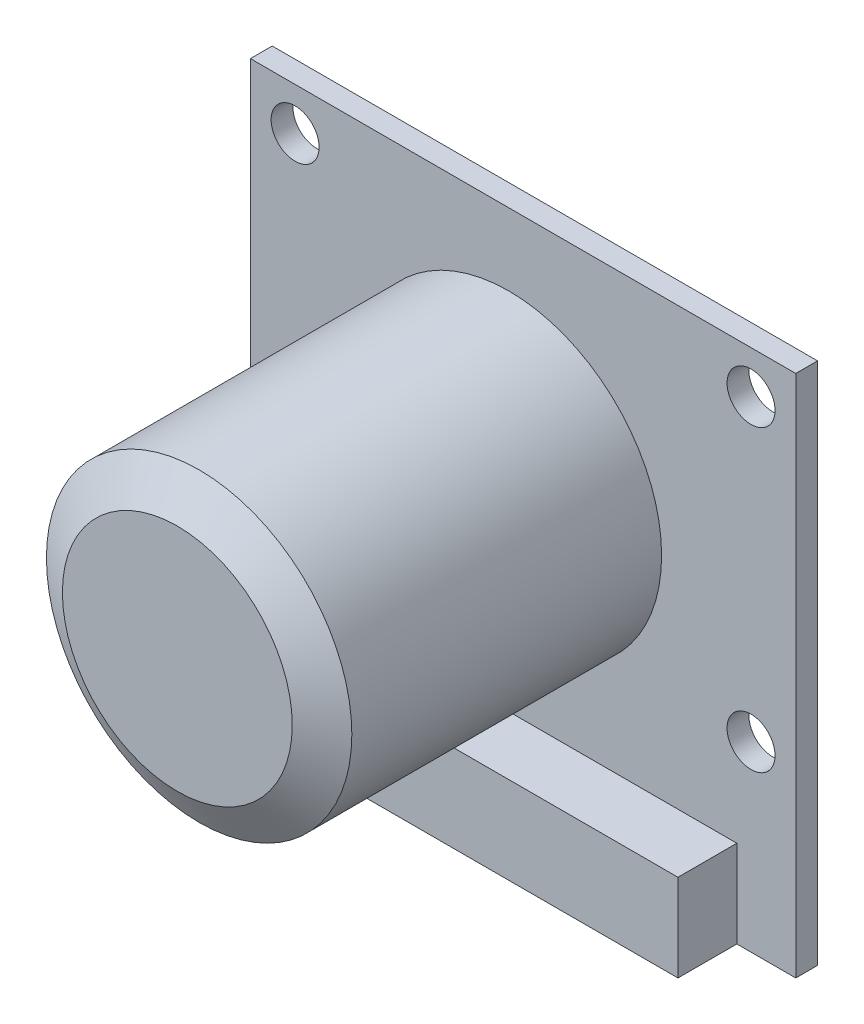
ISO-10303-21;
HEADER;
FILE_DESCRIPTION(('STEP AP214'),'2;1');
FILE_NAME('part.step','',(''),(''),'','','');
FILE_SCHEMA(('AUTOMOTIVE_DESIGN { 1 0 10303 214 1 1 1 1 }'));
ENDSEC;
DATA;
#1=APPLICATION_CONTEXT('core data for automotive mechanical design processes');
#2=APPLICATION_PROTOCOL_DEFINITION('international standard','automotive_design',2000,#1);
#3=PRODUCT_CONTEXT('',#1,'mechanical');
#4=PRODUCT('Part','Part','',(#3));
#5=PRODUCT_RELATED_PRODUCT_CATEGORY('part','',(#4));
#6=PRODUCT_DEFINITION_FORMATION('','',#4);
#7=PRODUCT_DEFINITION_CONTEXT('part definition',#1,'design');
#8=PRODUCT_DEFINITION('design','',#6,#7);
#9=PRODUCT_DEFINITION_SHAPE('','',#8);
#10=(LENGTH_UNIT() NAMED_UNIT(*) SI_UNIT(.MILLI.,.METRE.));
#11=(NAMED_UNIT(*) PLANE_ANGLE_UNIT() SI_UNIT($,.RADIAN.));
#12=(NAMED_UNIT(*) SI_UNIT($,.STERADIAN.) SOLID_ANGLE_UNIT());
#13=UNCERTAINTY_MEASURE_WITH_UNIT(LENGTH_MEASURE(1.E-05),#10,'distance_accuracy_value','');
#14=(GEOMETRIC_REPRESENTATION_CONTEXT(3) GLOBAL_UNCERTAINTY_ASSIGNED_CONTEXT((#13)) GLOBAL_UNIT_ASSIGNED_CONTEXT((#10,
#11,#12)) REPRESENTATION_CONTEXT('',''));
#15=CARTESIAN_POINT('',(0.,0.,0.));
#16=DIRECTION('',(0.,0.,1.));
#17=DIRECTION('',(1.,0.,0.));
#18=AXIS2_PLACEMENT_3D('',#15,#16,#17);
#19=CARTESIAN_POINT('',(12.5,12.,1.));
#20=DIRECTION('',(-1.,0.,0.));
#21=DIRECTION('',(0.,-1.,0.));
#22=AXIS2_PLACEMENT_3D('',#19,#20,#21);
#23=PLANE('',#22);
#24=DIRECTION('',(0.,1.,0.));
#25=VECTOR('',#24,1.);
#26=CARTESIAN_POINT('',(12.5,12.,0.));
#27=LINE('',#26,#25);
#28=CARTESIAN_POINT('',(12.5,-12.,0.));
#29=VERTEX_POINT('',#28);
#30=CARTESIAN_POINT('',(12.5,12.,0.));
#31=VERTEX_POINT('',#30);
#32=EDGE_CURVE('E129',#29,#31,#27,.T.);
#33=ORIENTED_EDGE('',*,*,#32,.T.);
#34=DIRECTION('',(0.,0.,-1.));
#35=VECTOR('',#34,1.);
#36=CARTESIAN_POINT('',(12.5,12.,1.));
#37=LINE('',#36,#35);
#38=CARTESIAN_POINT('',(12.5,12.,1.));
#39=VERTEX_POINT('',#38);
#40=EDGE_CURVE('E162',#39,#31,#37,.T.);
#41=ORIENTED_EDGE('',*,*,#40,.F.);
#42=DIRECTION('',(0.,1.,0.));
#43=VECTOR('',#42,1.);
#44=CARTESIAN_POINT('',(12.5,12.,1.));
#45=LINE('',#44,#43);
#46=CARTESIAN_POINT('',(12.5,-12.,1.));
#47=VERTEX_POINT('',#46);
#48=EDGE_CURVE('E138',#47,#39,#45,.T.);
#49=ORIENTED_EDGE('',*,*,#48,.F.);
#50=DIRECTION('',(0.,0.,-1.));
#51=VECTOR('',#50,1.);
#52=CARTESIAN_POINT('',(12.5,-12.,1.));
#53=LINE('',#52,#51);
#54=EDGE_CURVE('E148',#47,#29,#53,.T.);
#55=ORIENTED_EDGE('',*,*,#54,.T.);
#56=EDGE_LOOP('',(#33,#41,#49,#55));
#57=FACE_BOUND('',#56,.T.);
#58=ADVANCED_FACE('F41',(#57),#23,.F.);
#59=CARTESIAN_POINT('',(-12.5,12.,1.));
#60=DIRECTION('',(0.,-1.,0.));
#61=DIRECTION('',(0.,0.,-1.));
#62=AXIS2_PLACEMENT_3D('',#59,#60,#61);
#63=PLANE('',#62);
#64=DIRECTION('',(-1.,0.,0.));
#65=VECTOR('',#64,1.);
#66=CARTESIAN_POINT('',(-12.5,12.,0.));
#67=LINE('',#66,#65);
#68=CARTESIAN_POINT('',(-12.5,12.,0.));
#69=VERTEX_POINT('',#68);
#70=EDGE_CURVE('E132',#31,#69,#67,.T.);
#71=ORIENTED_EDGE('',*,*,#70,.T.);
#72=DIRECTION('',(0.,0.,-1.));
#73=VECTOR('',#72,1.);
#74=CARTESIAN_POINT('',(-12.5,12.,1.));
#75=LINE('',#74,#73);
#76=CARTESIAN_POINT('',(-12.5,12.,1.));
#77=VERTEX_POINT('',#76);
#78=EDGE_CURVE('E159',#77,#69,#75,.T.);
#79=ORIENTED_EDGE('',*,*,#78,.F.);
#80=DIRECTION('',(-1.,0.,0.));
#81=VECTOR('',#80,1.);
#82=CARTESIAN_POINT('',(-12.5,12.,1.));
#83=LINE('',#82,#81);
#84=EDGE_CURVE('E141',#39,#77,#83,.T.);
#85=ORIENTED_EDGE('',*,*,#84,.F.);
#86=ORIENTED_EDGE('',*,*,#40,.T.);
#87=EDGE_LOOP('',(#71,#79,#85,#86));
#88=FACE_BOUND('',#87,.T.);
#89=ADVANCED_FACE('F178',(#88),#63,.F.);
#90=CARTESIAN_POINT('',(-12.5,12.,1.));
#91=DIRECTION('',(1.,0.,0.));
#92=DIRECTION('',(0.,1.,0.));
#93=AXIS2_PLACEMENT_3D('',#90,#91,#92);
#94=PLANE('',#93);
#95=DIRECTION('',(0.,-1.,0.));
#96=VECTOR('',#95,1.);
#97=CARTESIAN_POINT('',(-12.5,12.,0.));
#98=LINE('',#97,#96);
#99=CARTESIAN_POINT('',(-12.5,-12.,0.));
#100=VERTEX_POINT('',#99);
#101=EDGE_CURVE('E151',#69,#100,#98,.T.);
#102=ORIENTED_EDGE('',*,*,#101,.T.);
#103=DIRECTION('',(0.,0.,-1.));
#104=VECTOR('',#103,1.);
#105=CARTESIAN_POINT('',(-12.5,-12.,1.));
#106=LINE('',#105,#104);
#107=CARTESIAN_POINT('',(-12.5,-12.,1.));
#108=VERTEX_POINT('',#107);
#109=EDGE_CURVE('E156',#108,#100,#106,.T.);
#110=ORIENTED_EDGE('',*,*,#109,.F.);
#111=DIRECTION('',(0.,-1.,0.));
#112=VECTOR('',#111,1.);
#113=CARTESIAN_POINT('',(-12.5,12.,1.));
#114=LINE('',#113,#112);
#115=EDGE_CURVE('E144',#77,#108,#114,.T.);
#116=ORIENTED_EDGE('',*,*,#115,.F.);
#117=ORIENTED_EDGE('',*,*,#78,.T.);
#118=EDGE_LOOP('',(#102,#110,#116,#117));
#119=FACE_BOUND('',#118,.T.);
#120=ADVANCED_FACE('F183',(#119),#94,.F.);
#121=CARTESIAN_POINT('',(-12.5,-12.,1.));
#122=DIRECTION('',(0.,1.,0.));
#123=DIRECTION('',(0.,0.,1.));
#124=AXIS2_PLACEMENT_3D('',#121,#122,#123);
#125=PLANE('',#124);
#126=DIRECTION('',(1.,0.,0.));
#127=VECTOR('',#126,1.);
#128=CARTESIAN_POINT('',(-12.5,-12.,0.));
#129=LINE('',#128,#127);
#130=EDGE_CURVE('E142',#100,#29,#129,.T.);
#131=ORIENTED_EDGE('',*,*,#130,.T.);
#132=ORIENTED_EDGE('',*,*,#54,.F.);
#133=DIRECTION('',(1.,0.,0.));
#134=VECTOR('',#133,1.);
#135=CARTESIAN_POINT('',(-12.5,-12.,1.));
#136=LINE('',#135,#134);
#137=CARTESIAN_POINT('',(9.8,-12.,1.));
#138=VERTEX_POINT('',#137);
#139=EDGE_CURVE('E146',#138,#47,#136,.T.);
#140=ORIENTED_EDGE('',*,*,#139,.F.);
#141=DIRECTION('',(0.,0.,-1.));
#142=VECTOR('',#141,1.);
#143=CARTESIAN_POINT('',(9.8,-12.,3.7));
#144=LINE('',#143,#142);
#145=CARTESIAN_POINT('',(9.8,-12.,3.7));
#146=VERTEX_POINT('',#145);
#147=EDGE_CURVE('E113',#146,#138,#144,.T.);
#148=ORIENTED_EDGE('',*,*,#147,.F.);
#149=DIRECTION('',(1.,0.,0.));
#150=VECTOR('',#149,1.);
#151=CARTESIAN_POINT('',(-10.6,-12.,3.7));
#152=LINE('',#151,#150);
#153=CARTESIAN_POINT('',(-10.6,-12.,3.7));
#154=VERTEX_POINT('',#153);
#155=EDGE_CURVE('E106',#154,#146,#152,.T.);
#156=ORIENTED_EDGE('',*,*,#155,.F.);
#157=DIRECTION('',(0.,0.,-1.));
#158=VECTOR('',#157,1.);
#159=CARTESIAN_POINT('',(-10.6,-12.,3.7));
#160=LINE('',#159,#158);
#161=CARTESIAN_POINT('',(-10.6,-12.,1.));
#162=VERTEX_POINT('',#161);
#163=EDGE_CURVE('E111',#154,#162,#160,.T.);
#164=ORIENTED_EDGE('',*,*,#163,.T.);
#165=EDGE_CURVE('E147',#108,#162,#136,.T.);
#166=ORIENTED_EDGE('',*,*,#165,.F.);
#167=ORIENTED_EDGE('',*,*,#109,.T.);
#168=EDGE_LOOP('',(#131,#132,#140,#148,#156,#164,#166,#167));
#169=FACE_BOUND('',#168,.T.);
#170=ADVANCED_FACE('F108',(#169),#125,.F.);
#171=CARTESIAN_POINT('',(0.,0.,1.));
#172=DIRECTION('',(0.,0.,1.));
#173=DIRECTION('',(1.,0.,0.));
#174=AXIS2_PLACEMENT_3D('',#171,#172,#173);
#175=PLANE('',#174);
#176=CARTESIAN_POINT('',(-0.649999999999998,1.7,1.));
#177=DIRECTION('',(0.,0.,1.));
#178=DIRECTION('',(1.,0.,0.));
#179=AXIS2_PLACEMENT_3D('',#176,#177,#178);
#180=CIRCLE('',#179,7.);
#181=CARTESIAN_POINT('',(-7.65,1.7,0.999999999999999));
#182=VERTEX_POINT('',#181);
#183=EDGE_CURVE('E235',#182,#182,#180,.T.);
#184=ORIENTED_EDGE('',*,*,#183,.F.);
#185=EDGE_LOOP('',(#184));
#186=FACE_BOUND('',#185,.T.);
#187=CARTESIAN_POINT('',(-10.45,10.05,1.));
#188=DIRECTION('',(0.,0.,1.));
#189=DIRECTION('',(1.,0.,0.));
#190=AXIS2_PLACEMENT_3D('',#187,#188,#189);
#191=CIRCLE('',#190,1.1);
#192=CARTESIAN_POINT('',(-9.35,10.05,1.));
#193=VERTEX_POINT('',#192);
#194=EDGE_CURVE('E259',#193,#193,#191,.T.);
#195=ORIENTED_EDGE('',*,*,#194,.F.);
#196=EDGE_LOOP('',(#195));
#197=FACE_BOUND('',#196,.T.);
#198=CARTESIAN_POINT('',(10.45,-3.65,1.));
#199=DIRECTION('',(0.,0.,1.));
#200=DIRECTION('',(1.,0.,0.));
#201=AXIS2_PLACEMENT_3D('',#198,#199,#200);
#202=CIRCLE('',#201,1.1);
#203=CARTESIAN_POINT('',(11.55,-3.65,1.));
#204=VERTEX_POINT('',#203);
#205=EDGE_CURVE('E256',#204,#204,#202,.T.);
#206=ORIENTED_EDGE('',*,*,#205,.F.);
#207=EDGE_LOOP('',(#206));
#208=FACE_BOUND('',#207,.T.);
#209=CARTESIAN_POINT('',(-10.45,-3.65,1.));
#210=DIRECTION('',(0.,0.,1.));
#211=DIRECTION('',(1.,0.,0.));
#212=AXIS2_PLACEMENT_3D('',#209,#210,#211);
#213=CIRCLE('',#212,1.1);
#214=CARTESIAN_POINT('',(-9.35,-3.65,1.));
#215=VERTEX_POINT('',#214);
#216=EDGE_CURVE('E253',#215,#215,#213,.T.);
#217=ORIENTED_EDGE('',*,*,#216,.F.);
#218=EDGE_LOOP('',(#217));
#219=FACE_BOUND('',#218,.T.);
#220=CARTESIAN_POINT('',(10.45,10.05,1.));
#221=DIRECTION('',(0.,0.,1.));
#222=DIRECTION('',(1.,0.,0.));
#223=AXIS2_PLACEMENT_3D('',#220,#221,#222);
#224=CIRCLE('',#223,1.1);
#225=CARTESIAN_POINT('',(11.55,10.05,1.));
#226=VERTEX_POINT('',#225);
#227=EDGE_CURVE('E250',#226,#226,#224,.T.);
#228=ORIENTED_EDGE('',*,*,#227,.F.);
#229=EDGE_LOOP('',(#228));
#230=FACE_BOUND('',#229,.T.);
#231=DIRECTION('',(0.,-1.,0.));
#232=VECTOR('',#231,1.);
#233=CARTESIAN_POINT('',(-10.6,-7.99999999999999,1.));
#234=LINE('',#233,#232);
#235=CARTESIAN_POINT('',(-10.6,-7.99999999999999,1.));
#236=VERTEX_POINT('',#235);
#237=EDGE_CURVE('E57',#236,#162,#234,.T.);
#238=ORIENTED_EDGE('',*,*,#237,.F.);
#239=DIRECTION('',(-1.,0.,0.));
#240=VECTOR('',#239,1.);
#241=CARTESIAN_POINT('',(-10.6,-7.99999999999999,1.));
#242=LINE('',#241,#240);
#243=CARTESIAN_POINT('',(9.8,-8.,1.));
#244=VERTEX_POINT('',#243);
#245=EDGE_CURVE('E126',#244,#236,#242,.T.);
#246=ORIENTED_EDGE('',*,*,#245,.F.);
#247=DIRECTION('',(0.,1.,0.));
#248=VECTOR('',#247,1.);
#249=CARTESIAN_POINT('',(9.8,-8.,1.));
#250=LINE('',#249,#248);
#251=EDGE_CURVE('E63',#138,#244,#250,.T.);
#252=ORIENTED_EDGE('',*,*,#251,.F.);
#253=ORIENTED_EDGE('',*,*,#139,.T.);
#254=ORIENTED_EDGE('',*,*,#48,.T.);
#255=ORIENTED_EDGE('',*,*,#84,.T.);
#256=ORIENTED_EDGE('',*,*,#115,.T.);
#257=ORIENTED_EDGE('',*,*,#165,.T.);
#258=EDGE_LOOP('',(#238,#246,#252,#253,#254,#255,#256,#257));
#259=FACE_BOUND('',#258,.T.);
#260=ADVANCED_FACE('F192',(#186,#197,#208,#219,#230,#259),#175,.T.);
#261=CARTESIAN_POINT('',(0.,0.,0.));
#262=DIRECTION('',(0.,0.,1.));
#263=DIRECTION('',(1.,0.,0.));
#264=AXIS2_PLACEMENT_3D('',#261,#262,#263);
#265=PLANE('',#264);
#266=CARTESIAN_POINT('',(-10.45,10.05,0.));
#267=DIRECTION('',(0.,0.,1.));
#268=DIRECTION('',(1.,0.,0.));
#269=AXIS2_PLACEMENT_3D('',#266,#267,#268);
#270=CIRCLE('',#269,1.1);
#271=CARTESIAN_POINT('',(-9.35,10.05,0.));
#272=VERTEX_POINT('',#271);
#273=EDGE_CURVE('E242',#272,#272,#270,.T.);
#274=ORIENTED_EDGE('',*,*,#273,.T.);
#275=EDGE_LOOP('',(#274));
#276=FACE_BOUND('',#275,.T.);
#277=CARTESIAN_POINT('',(10.45,-3.65,0.));
#278=DIRECTION('',(0.,0.,1.));
#279=DIRECTION('',(1.,0.,0.));
#280=AXIS2_PLACEMENT_3D('',#277,#278,#279);
#281=CIRCLE('',#280,1.1);
#282=CARTESIAN_POINT('',(11.55,-3.65,0.));
#283=VERTEX_POINT('',#282);
#284=EDGE_CURVE('E239',#283,#283,#281,.T.);
#285=ORIENTED_EDGE('',*,*,#284,.T.);
#286=EDGE_LOOP('',(#285));
#287=FACE_BOUND('',#286,.T.);
#288=CARTESIAN_POINT('',(-10.45,-3.65,0.));
#289=DIRECTION('',(0.,0.,1.));
#290=DIRECTION('',(1.,0.,0.));
#291=AXIS2_PLACEMENT_3D('',#288,#289,#290);
#292=CIRCLE('',#291,1.1);
#293=CARTESIAN_POINT('',(-9.35,-3.65,0.));
#294=VERTEX_POINT('',#293);
#295=EDGE_CURVE('E236',#294,#294,#292,.T.);
#296=ORIENTED_EDGE('',*,*,#295,.T.);
#297=EDGE_LOOP('',(#296));
#298=FACE_BOUND('',#297,.T.);
#299=CARTESIAN_POINT('',(10.45,10.05,0.));
#300=DIRECTION('',(0.,0.,1.));
#301=DIRECTION('',(1.,0.,0.));
#302=AXIS2_PLACEMENT_3D('',#299,#300,#301);
#303=CIRCLE('',#302,1.1);
#304=CARTESIAN_POINT('',(11.55,10.05,0.));
#305=VERTEX_POINT('',#304);
#306=EDGE_CURVE('E245',#305,#305,#303,.T.);
#307=ORIENTED_EDGE('',*,*,#306,.T.);
#308=EDGE_LOOP('',(#307));
#309=FACE_BOUND('',#308,.T.);
#310=ORIENTED_EDGE('',*,*,#32,.F.);
#311=ORIENTED_EDGE('',*,*,#130,.F.);
#312=ORIENTED_EDGE('',*,*,#101,.F.);
#313=ORIENTED_EDGE('',*,*,#70,.F.);
#314=EDGE_LOOP('',(#310,#311,#312,#313));
#315=FACE_BOUND('',#314,.T.);
#316=ADVANCED_FACE('F193',(#276,#287,#298,#309,#315),#265,.F.);
#317=CARTESIAN_POINT('',(-10.6,-7.99999999999999,3.7));
#318=DIRECTION('',(1.,0.,0.));
#319=DIRECTION('',(0.,0.,-1.));
#320=AXIS2_PLACEMENT_3D('',#317,#318,#319);
#321=PLANE('',#320);
#322=ORIENTED_EDGE('',*,*,#237,.T.);
#323=ORIENTED_EDGE('',*,*,#163,.F.);
#324=DIRECTION('',(0.,-1.,0.));
#325=VECTOR('',#324,1.);
#326=CARTESIAN_POINT('',(-10.6,-7.99999999999999,3.7));
#327=LINE('',#326,#325);
#328=CARTESIAN_POINT('',(-10.6,-7.99999999999999,3.7));
#329=VERTEX_POINT('',#328);
#330=EDGE_CURVE('E117',#329,#154,#327,.T.);
#331=ORIENTED_EDGE('',*,*,#330,.F.);
#332=DIRECTION('',(0.,0.,-1.));
#333=VECTOR('',#332,1.);
#334=CARTESIAN_POINT('',(-10.6,-7.99999999999999,3.7));
#335=LINE('',#334,#333);
#336=EDGE_CURVE('E264',#329,#236,#335,.T.);
#337=ORIENTED_EDGE('',*,*,#336,.T.);
#338=EDGE_LOOP('',(#322,#323,#331,#337));
#339=FACE_BOUND('',#338,.T.);
#340=ADVANCED_FACE('F128',(#339),#321,.F.);
#341=CARTESIAN_POINT('',(9.8,-8.,3.7));
#342=DIRECTION('',(-1.,0.,0.));
#343=DIRECTION('',(0.,-1.,0.));
#344=AXIS2_PLACEMENT_3D('',#341,#342,#343);
#345=PLANE('',#344);
#346=ORIENTED_EDGE('',*,*,#251,.T.);
#347=DIRECTION('',(0.,0.,-1.));
#348=VECTOR('',#347,1.);
#349=CARTESIAN_POINT('',(9.8,-8.,3.7));
#350=LINE('',#349,#348);
#351=CARTESIAN_POINT('',(9.8,-8.,3.7));
#352=VERTEX_POINT('',#351);
#353=EDGE_CURVE('E134',#352,#244,#350,.T.);
#354=ORIENTED_EDGE('',*,*,#353,.F.);
#355=DIRECTION('',(0.,1.,0.));
#356=VECTOR('',#355,1.);
#357=CARTESIAN_POINT('',(9.8,-8.,3.7));
#358=LINE('',#357,#356);
#359=EDGE_CURVE('E116',#146,#352,#358,.T.);
#360=ORIENTED_EDGE('',*,*,#359,.F.);
#361=ORIENTED_EDGE('',*,*,#147,.T.);
#362=EDGE_LOOP('',(#346,#354,#360,#361));
#363=FACE_BOUND('',#362,.T.);
#364=ADVANCED_FACE('F202',(#363),#345,.F.);
#365=CARTESIAN_POINT('',(-10.6,-7.99999999999999,3.7));
#366=DIRECTION('',(0.,-1.,0.));
#367=DIRECTION('',(1.,0.,0.));
#368=AXIS2_PLACEMENT_3D('',#365,#366,#367);
#369=PLANE('',#368);
#370=ORIENTED_EDGE('',*,*,#245,.T.);
#371=ORIENTED_EDGE('',*,*,#336,.F.);
#372=DIRECTION('',(-1.,0.,0.));
#373=VECTOR('',#372,1.);
#374=CARTESIAN_POINT('',(-10.6,-7.99999999999999,3.7));
#375=LINE('',#374,#373);
#376=EDGE_CURVE('E122',#352,#329,#375,.T.);
#377=ORIENTED_EDGE('',*,*,#376,.F.);
#378=ORIENTED_EDGE('',*,*,#353,.T.);
#379=EDGE_LOOP('',(#370,#371,#377,#378));
#380=FACE_BOUND('',#379,.T.);
#381=ADVANCED_FACE('F205',(#380),#369,.F.);
#382=CARTESIAN_POINT('',(0.,0.,3.7));
#383=DIRECTION('',(0.,0.,1.));
#384=DIRECTION('',(1.,0.,0.));
#385=AXIS2_PLACEMENT_3D('',#382,#383,#384);
#386=PLANE('',#385);
#387=ORIENTED_EDGE('',*,*,#330,.T.);
#388=ORIENTED_EDGE('',*,*,#155,.T.);
#389=ORIENTED_EDGE('',*,*,#359,.T.);
#390=ORIENTED_EDGE('',*,*,#376,.T.);
#391=EDGE_LOOP('',(#387,#388,#389,#390));
#392=FACE_BOUND('',#391,.T.);
#393=ADVANCED_FACE('F120',(#392),#386,.T.);
#394=CARTESIAN_POINT('',(10.45,10.05,0.));
#395=DIRECTION('',(0.,0.,1.));
#396=DIRECTION('',(1.,0.,0.));
#397=AXIS2_PLACEMENT_3D('',#394,#395,#396);
#398=CYLINDRICAL_SURFACE('',#397,1.1);
#399=ORIENTED_EDGE('',*,*,#227,.T.);
#400=EDGE_LOOP('',(#399));
#401=FACE_BOUND('',#400,.T.);
#402=ORIENTED_EDGE('',*,*,#306,.F.);
#403=EDGE_LOOP('',(#402));
#404=FACE_BOUND('',#403,.T.);
#405=ADVANCED_FACE('F212',(#401,#404),#398,.F.);
#406=CARTESIAN_POINT('',(-10.45,-3.65,0.));
#407=DIRECTION('',(0.,0.,1.));
#408=DIRECTION('',(1.,0.,0.));
#409=AXIS2_PLACEMENT_3D('',#406,#407,#408);
#410=CYLINDRICAL_SURFACE('',#409,1.1);
#411=ORIENTED_EDGE('',*,*,#216,.T.);
#412=EDGE_LOOP('',(#411));
#413=FACE_BOUND('',#412,.T.);
#414=ORIENTED_EDGE('',*,*,#295,.F.);
#415=EDGE_LOOP('',(#414));
#416=FACE_BOUND('',#415,.T.);
#417=ADVANCED_FACE('F215',(#413,#416),#410,.F.);
#418=CARTESIAN_POINT('',(10.45,-3.65,0.));
#419=DIRECTION('',(0.,0.,1.));
#420=DIRECTION('',(1.,0.,0.));
#421=AXIS2_PLACEMENT_3D('',#418,#419,#420);
#422=CYLINDRICAL_SURFACE('',#421,1.1);
#423=ORIENTED_EDGE('',*,*,#205,.T.);
#424=EDGE_LOOP('',(#423));
#425=FACE_BOUND('',#424,.T.);
#426=ORIENTED_EDGE('',*,*,#284,.F.);
#427=EDGE_LOOP('',(#426));
#428=FACE_BOUND('',#427,.T.);
#429=ADVANCED_FACE('F217',(#425,#428),#422,.F.);
#430=CARTESIAN_POINT('',(-10.45,10.05,0.));
#431=DIRECTION('',(0.,0.,1.));
#432=DIRECTION('',(1.,0.,0.));
#433=AXIS2_PLACEMENT_3D('',#430,#431,#432);
#434=CYLINDRICAL_SURFACE('',#433,1.1);
#435=ORIENTED_EDGE('',*,*,#194,.T.);
#436=EDGE_LOOP('',(#435));
#437=FACE_BOUND('',#436,.T.);
#438=ORIENTED_EDGE('',*,*,#273,.F.);
#439=EDGE_LOOP('',(#438));
#440=FACE_BOUND('',#439,.T.);
#441=ADVANCED_FACE('F220',(#437,#440),#434,.F.);
#442=CARTESIAN_POINT('',(-0.649999999999998,1.7,16.2));
#443=DIRECTION('',(0.,0.,-1.));
#444=DIRECTION('',(-1.,0.,0.));
#445=AXIS2_PLACEMENT_3D('',#442,#443,#444);
#446=CYLINDRICAL_SURFACE('',#445,7.);
#447=CARTESIAN_POINT('',(-0.649999999999998,1.7,15.2));
#448=DIRECTION('',(0.,0.,1.));
#449=DIRECTION('',(1.,0.,0.));
#450=AXIS2_PLACEMENT_3D('',#447,#448,#449);
#451=CIRCLE('',#450,7.);
#452=CARTESIAN_POINT('',(-7.65,1.7,15.2));
#453=VERTEX_POINT('',#452);
#454=EDGE_CURVE('E11',#453,#453,#451,.F.);
#455=CARTESIAN_POINT('',(-7.65,1.7,15.2));
#456=CARTESIAN_POINT('',(-7.65,1.7,15.0520833333333));
#457=CARTESIAN_POINT('',(-7.65,1.7,14.9041666666667));
#458=CARTESIAN_POINT('',(-7.65,1.7,14.6083333333333));
#459=CARTESIAN_POINT('',(-7.65,1.7,14.4604166666667));
#460=CARTESIAN_POINT('',(-7.65,1.7,14.1645833333333));
#461=CARTESIAN_POINT('',(-7.65,1.7,14.0166666666667));
#462=CARTESIAN_POINT('',(-7.65,1.7,13.7208333333333));
#463=CARTESIAN_POINT('',(-7.65,1.7,13.5729166666667));
#464=CARTESIAN_POINT('',(-7.65,1.7,13.2770833333333));
#465=CARTESIAN_POINT('',(-7.65,1.7,13.1291666666667));
#466=CARTESIAN_POINT('',(-7.65,1.7,12.8333333333333));
#467=CARTESIAN_POINT('',(-7.65,1.7,12.6854166666667));
#468=CARTESIAN_POINT('',(-7.65,1.7,12.3895833333333));
#469=CARTESIAN_POINT('',(-7.65,1.7,12.2416666666667));
#470=CARTESIAN_POINT('',(-7.65,1.7,11.9458333333333));
#471=CARTESIAN_POINT('',(-7.65,1.7,11.7979166666667));
#472=CARTESIAN_POINT('',(-7.65,1.7,11.5020833333333));
#473=CARTESIAN_POINT('',(-7.65,1.7,11.3541666666667));
#474=CARTESIAN_POINT('',(-7.65,1.7,11.0583333333333));
#475=CARTESIAN_POINT('',(-7.65,1.7,10.9104166666667));
#476=CARTESIAN_POINT('',(-7.65,1.7,10.6145833333333));
#477=CARTESIAN_POINT('',(-7.65,1.7,10.4666666666667));
#478=CARTESIAN_POINT('',(-7.65,1.7,10.1708333333333));
#479=CARTESIAN_POINT('',(-7.65,1.7,10.0229166666667));
#480=CARTESIAN_POINT('',(-7.65,1.7,9.72708333333334));
#481=CARTESIAN_POINT('',(-7.65,1.7,9.57916666666667));
#482=CARTESIAN_POINT('',(-7.65,1.7,9.28333333333334));
#483=CARTESIAN_POINT('',(-7.65,1.7,9.13541666666667));
#484=CARTESIAN_POINT('',(-7.65,1.7,8.83958333333334));
#485=CARTESIAN_POINT('',(-7.65,1.7,8.69166666666667));
#486=CARTESIAN_POINT('',(-7.65,1.7,8.39583333333334));
#487=CARTESIAN_POINT('',(-7.65,1.7,8.24791666666667));
#488=CARTESIAN_POINT('',(-7.65,1.7,7.95208333333334));
#489=CARTESIAN_POINT('',(-7.65,1.7,7.80416666666667));
#490=CARTESIAN_POINT('',(-7.65,1.7,7.50833333333333));
#491=CARTESIAN_POINT('',(-7.65,1.7,7.36041666666667));
#492=CARTESIAN_POINT('',(-7.65,1.7,7.06458333333333));
#493=CARTESIAN_POINT('',(-7.65,1.7,6.91666666666667));
#494=CARTESIAN_POINT('',(-7.65,1.7,6.62083333333334));
#495=CARTESIAN_POINT('',(-7.65,1.7,6.47291666666667));
#496=CARTESIAN_POINT('',(-7.65,1.7,6.17708333333333));
#497=CARTESIAN_POINT('',(-7.65,1.7,6.02916666666667));
#498=CARTESIAN_POINT('',(-7.65,1.7,5.73333333333333));
#499=CARTESIAN_POINT('',(-7.65,1.7,5.58541666666667));
#500=CARTESIAN_POINT('',(-7.65,1.7,5.28958333333333));
#501=CARTESIAN_POINT('',(-7.65,1.7,5.14166666666667));
#502=CARTESIAN_POINT('',(-7.65,1.7,4.84583333333333));
#503=CARTESIAN_POINT('',(-7.65,1.7,4.69791666666667));
#504=CARTESIAN_POINT('',(-7.65,1.7,4.40208333333333));
#505=CARTESIAN_POINT('',(-7.65,1.7,4.25416666666667));
#506=CARTESIAN_POINT('',(-7.65,1.7,3.95833333333333));
#507=CARTESIAN_POINT('',(-7.65,1.7,3.81041666666667));
#508=CARTESIAN_POINT('',(-7.65,1.7,3.51458333333333));
#509=CARTESIAN_POINT('',(-7.65,1.7,3.36666666666667));
#510=CARTESIAN_POINT('',(-7.65,1.7,3.07083333333333));
#511=CARTESIAN_POINT('',(-7.65,1.7,2.92291666666667));
#512=CARTESIAN_POINT('',(-7.65,1.7,2.62708333333333));
#513=CARTESIAN_POINT('',(-7.65,1.7,2.47916666666667));
#514=CARTESIAN_POINT('',(-7.65,1.7,2.18333333333333));
#515=CARTESIAN_POINT('',(-7.65,1.7,2.03541666666667));
#516=CARTESIAN_POINT('',(-7.65,1.7,1.73958333333333));
#517=CARTESIAN_POINT('',(-7.65,1.7,1.59166666666667));
#518=CARTESIAN_POINT('',(-7.65,1.7,1.29583333333333));
#519=CARTESIAN_POINT('',(-7.65,1.7,1.14791666666667));
#520=CARTESIAN_POINT('',(-7.65,1.7,0.999999999999999));
#521=B_SPLINE_CURVE_WITH_KNOTS('',3,(#455,#456,#457,#458,#459,#460,#461,#462,#463,#464,#465,
#466,#467,#468,#469,#470,#471,#472,#473,#474,#475,#476,#477,#478,#479,#480,#481,#482,#483,#484,
#485,#486,#487,#488,#489,#490,#491,#492,#493,#494,#495,#496,#497,#498,#499,#500,#501,#502,#503,
#504,#505,#506,#507,#508,#509,#510,#511,#512,#513,#514,#515,#516,#517,#518,#519,#520),
.UNSPECIFIED.,.F.,.F.,(4,2,2,2,2,2,2,2,2,2,2,2,2,2,2,2,2,2,2,2,2,2,2,2,2,2,2,2,2,2,2,2,4),(0.,
0.44375,0.887499999999999,1.33125,1.775,2.21875,2.6625,3.10625,3.55,3.99375,4.4375,4.88125,
5.325,5.76875,6.2125,6.65625,7.1,7.54375,7.9875,8.43125,8.875,9.31875,9.7625,10.20625,10.65,
11.09375,11.5375,11.98125,12.425,12.86875,13.3125,13.75625,14.2),.UNSPECIFIED.);
#522=EDGE_CURVE('BSEAM174',#453,#182,#521,.T.);
#523=ORIENTED_EDGE('',*,*,#454,.T.);
#524=ORIENTED_EDGE('',*,*,#183,.T.);
#525=ORIENTED_EDGE('',*,*,#522,.T.);
#526=ORIENTED_EDGE('',*,*,#522,.F.);
#527=EDGE_LOOP('',(#523,#525,#524,#526));
#528=FACE_BOUND('',#527,.T.);
#529=ADVANCED_FACE('F174',(#528),#446,.T.);
#530=CARTESIAN_POINT('',(-0.649999999999998,1.7,16.2));
#531=DIRECTION('',(0.,0.,1.));
#532=DIRECTION('',(1.,0.,0.));
#533=AXIS2_PLACEMENT_3D('',#530,#531,#532);
#534=PLANE('',#533);
#535=CARTESIAN_POINT('',(-0.649999999999998,1.7,16.2));
#536=DIRECTION('',(0.,0.,1.));
#537=DIRECTION('',(1.,0.,0.));
#538=AXIS2_PLACEMENT_3D('',#535,#536,#537);
#539=CIRCLE('',#538,5.26794919243114);
#540=CARTESIAN_POINT('',(4.61794919243114,1.7,16.2));
#541=VERTEX_POINT('',#540);
#542=EDGE_CURVE('E50',#541,#541,#539,.T.);
#543=ORIENTED_EDGE('',*,*,#542,.T.);
#544=EDGE_LOOP('',(#543));
#545=FACE_BOUND('',#544,.T.);
#546=ADVANCED_FACE('F167',(#545),#534,.T.);
#547=CARTESIAN_POINT('',(-0.649999999999998,1.7,16.2));
#548=DIRECTION('',(0.,0.,-1.));
#549=DIRECTION('',(-1.,0.,0.));
#550=AXIS2_PLACEMENT_3D('',#547,#548,#549);
#551=CONICAL_SURFACE('',#550,5.26794919243114,1.0471975511966);
#552=ORIENTED_EDGE('',*,*,#454,.F.);
#553=EDGE_LOOP('',(#552));
#554=FACE_BOUND('',#553,.T.);
#555=ORIENTED_EDGE('',*,*,#542,.F.);
#556=EDGE_LOOP('',(#555));
#557=FACE_BOUND('',#556,.T.);
#558=ADVANCED_FACE('F44',(#554,#557),#551,.T.);
#559=CLOSED_SHELL('',(#58,#89,#120,#170,#260,#316,#340,#364,#381,#393,#405,#417,#429,#441,#529,
#546,#558));
#560=MANIFOLD_SOLID_BREP('B2',#559);
#561=ADVANCED_BREP_SHAPE_REPRESENTATION('',(#18,#560),#14);
#562=SHAPE_DEFINITION_REPRESENTATION(#9,#561);
ENDSEC;
END-ISO-10303-21;
